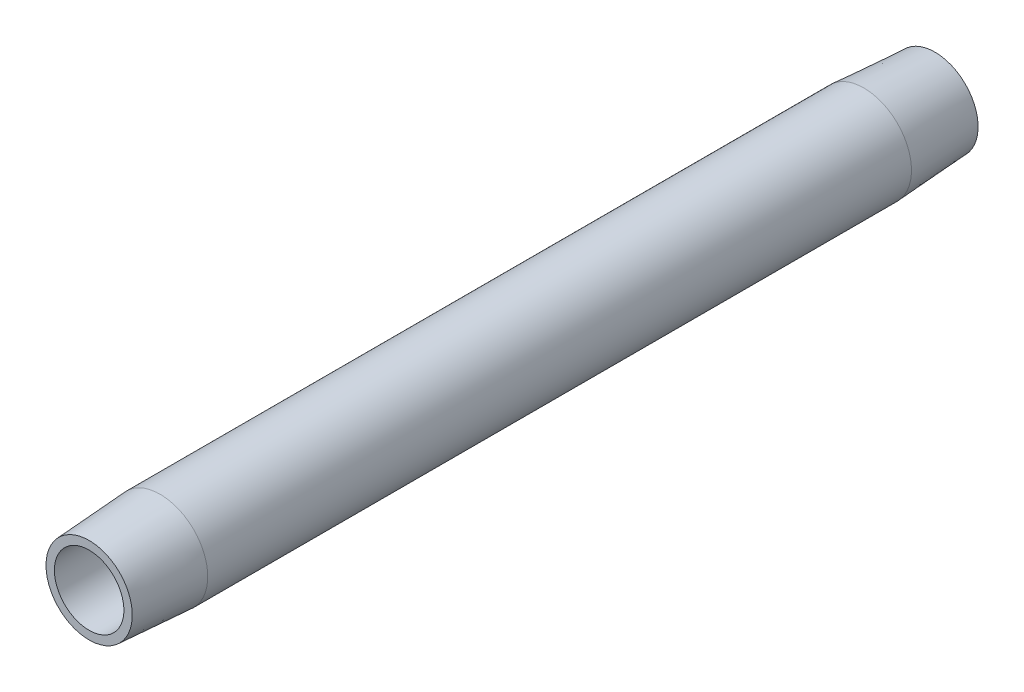
ISO-10303-21;
HEADER;
FILE_DESCRIPTION(('STEP AP214'),'2;1');
FILE_NAME('part.step','',(''),(''),'','','');
FILE_SCHEMA(('AUTOMOTIVE_DESIGN { 1 0 10303 214 1 1 1 1 }'));
ENDSEC;
DATA;
#1=APPLICATION_CONTEXT('core data for automotive mechanical design processes');
#2=APPLICATION_PROTOCOL_DEFINITION('international standard','automotive_design',2000,#1);
#3=PRODUCT_CONTEXT('',#1,'mechanical');
#4=PRODUCT('Part','Part','',(#3));
#5=PRODUCT_RELATED_PRODUCT_CATEGORY('part','',(#4));
#6=PRODUCT_DEFINITION_FORMATION('','',#4);
#7=PRODUCT_DEFINITION_CONTEXT('part definition',#1,'design');
#8=PRODUCT_DEFINITION('design','',#6,#7);
#9=PRODUCT_DEFINITION_SHAPE('','',#8);
#10=(LENGTH_UNIT() NAMED_UNIT(*) SI_UNIT(.MILLI.,.METRE.));
#11=(NAMED_UNIT(*) PLANE_ANGLE_UNIT() SI_UNIT($,.RADIAN.));
#12=(NAMED_UNIT(*) SI_UNIT($,.STERADIAN.) SOLID_ANGLE_UNIT());
#13=UNCERTAINTY_MEASURE_WITH_UNIT(LENGTH_MEASURE(1.E-05),#10,'distance_accuracy_value','');
#14=(GEOMETRIC_REPRESENTATION_CONTEXT(3) GLOBAL_UNCERTAINTY_ASSIGNED_CONTEXT((#13)) GLOBAL_UNIT_ASSIGNED_CONTEXT((#10,
#11,#12)) REPRESENTATION_CONTEXT('',''));
#15=CARTESIAN_POINT('',(0.,0.,0.));
#16=DIRECTION('',(0.,0.,1.));
#17=DIRECTION('',(1.,0.,0.));
#18=AXIS2_PLACEMENT_3D('',#15,#16,#17);
#19=CARTESIAN_POINT('',(0.,0.,-152.4));
#20=DIRECTION('',(0.,0.,1.));
#21=DIRECTION('',(1.,0.,0.));
#22=AXIS2_PLACEMENT_3D('',#19,#20,#21);
#23=CONICAL_SURFACE('',#22,7.77252700045649,0.0624188099249585);
#24=CARTESIAN_POINT('',(0.,0.,-139.60043200001));
#25=DIRECTION('',(0.,0.,-1.));
#26=DIRECTION('',(-1.,0.,0.));
#27=AXIS2_PLACEMENT_3D('',#24,#25,#26);
#28=CIRCLE('',#27,8.57249999954359);
#29=CARTESIAN_POINT('',(-8.57249999954359,0.,-139.60043200001));
#30=VERTEX_POINT('',#29);
#31=EDGE_CURVE('E10',#30,#30,#28,.T.);
#32=ORIENTED_EDGE('',*,*,#31,.T.);
#33=EDGE_LOOP('',(#32));
#34=FACE_BOUND('',#33,.T.);
#35=CARTESIAN_POINT('',(0.,0.,-152.4));
#36=DIRECTION('',(0.,0.,-1.));
#37=DIRECTION('',(-1.,0.,0.));
#38=AXIS2_PLACEMENT_3D('',#35,#36,#37);
#39=CIRCLE('',#38,7.77252700045649);
#40=CARTESIAN_POINT('',(-7.77252700045649,0.,-152.4));
#41=VERTEX_POINT('',#40);
#42=EDGE_CURVE('E52',#41,#41,#39,.T.);
#43=ORIENTED_EDGE('',*,*,#42,.F.);
#44=EDGE_LOOP('',(#43));
#45=FACE_BOUND('',#44,.T.);
#46=ADVANCED_FACE('F30',(#34,#45),#23,.T.);
#47=CARTESIAN_POINT('',(0.,0.,0.));
#48=DIRECTION('',(0.,0.,-1.));
#49=DIRECTION('',(-1.,0.,0.));
#50=AXIS2_PLACEMENT_3D('',#47,#48,#49);
#51=CYLINDRICAL_SURFACE('',#50,8.57249999954359);
#52=CARTESIAN_POINT('',(0.,0.,-12.7995679999904));
#53=DIRECTION('',(0.,0.,-1.));
#54=DIRECTION('',(-1.,0.,0.));
#55=AXIS2_PLACEMENT_3D('',#52,#53,#54);
#56=CIRCLE('',#55,8.57249999954358);
#57=CARTESIAN_POINT('',(-8.57249999954358,0.,-12.7995679999904));
#58=VERTEX_POINT('',#57);
#59=EDGE_CURVE('E36',#58,#58,#56,.T.);
#60=ORIENTED_EDGE('',*,*,#59,.T.);
#61=EDGE_LOOP('',(#60));
#62=FACE_BOUND('',#61,.T.);
#63=ORIENTED_EDGE('',*,*,#31,.F.);
#64=EDGE_LOOP('',(#63));
#65=FACE_BOUND('',#64,.T.);
#66=ADVANCED_FACE('F60',(#62,#65),#51,.T.);
#67=CARTESIAN_POINT('',(0.,0.,-12.7995679999904));
#68=DIRECTION('',(0.,0.,-1.));
#69=DIRECTION('',(-1.,0.,0.));
#70=AXIS2_PLACEMENT_3D('',#67,#68,#69);
#71=CONICAL_SURFACE('',#70,8.57249999954358,0.0624188099249577);
#72=CARTESIAN_POINT('',(0.,0.,0.));
#73=DIRECTION('',(0.,0.,-1.));
#74=DIRECTION('',(-1.,0.,0.));
#75=AXIS2_PLACEMENT_3D('',#72,#73,#74);
#76=CIRCLE('',#75,7.77252700045649);
#77=CARTESIAN_POINT('',(-7.77252700045649,0.,0.));
#78=VERTEX_POINT('',#77);
#79=EDGE_CURVE('E40',#78,#78,#76,.T.);
#80=ORIENTED_EDGE('',*,*,#79,.T.);
#81=EDGE_LOOP('',(#80));
#82=FACE_BOUND('',#81,.T.);
#83=ORIENTED_EDGE('',*,*,#59,.F.);
#84=EDGE_LOOP('',(#83));
#85=FACE_BOUND('',#84,.T.);
#86=ADVANCED_FACE('F64',(#82,#85),#71,.T.);
#87=CARTESIAN_POINT('',(7.77252700045649,0.,0.));
#88=DIRECTION('',(0.,0.,1.));
#89=DIRECTION('',(1.,0.,0.));
#90=AXIS2_PLACEMENT_3D('',#87,#88,#89);
#91=PLANE('',#90);
#92=CARTESIAN_POINT('',(0.,0.,0.));
#93=DIRECTION('',(0.,0.,-1.));
#94=DIRECTION('',(-1.,0.,0.));
#95=AXIS2_PLACEMENT_3D('',#92,#93,#94);
#96=CIRCLE('',#95,6.26109999999999);
#97=CARTESIAN_POINT('',(-6.26109999999999,0.,0.));
#98=VERTEX_POINT('',#97);
#99=EDGE_CURVE('E44',#98,#98,#96,.T.);
#100=ORIENTED_EDGE('',*,*,#99,.T.);
#101=EDGE_LOOP('',(#100));
#102=FACE_BOUND('',#101,.T.);
#103=ORIENTED_EDGE('',*,*,#79,.F.);
#104=EDGE_LOOP('',(#103));
#105=FACE_BOUND('',#104,.T.);
#106=ADVANCED_FACE('F68',(#102,#105),#91,.T.);
#107=CARTESIAN_POINT('',(0.,0.,0.));
#108=DIRECTION('',(0.,0.,-1.));
#109=DIRECTION('',(-1.,0.,0.));
#110=AXIS2_PLACEMENT_3D('',#107,#108,#109);
#111=CYLINDRICAL_SURFACE('',#110,6.2611);
#112=CARTESIAN_POINT('',(0.,0.,-152.4));
#113=DIRECTION('',(0.,0.,-1.));
#114=DIRECTION('',(-1.,0.,0.));
#115=AXIS2_PLACEMENT_3D('',#112,#113,#114);
#116=CIRCLE('',#115,6.26110000000001);
#117=CARTESIAN_POINT('',(-6.26110000000001,0.,-152.4));
#118=VERTEX_POINT('',#117);
#119=EDGE_CURVE('E49',#118,#118,#116,.T.);
#120=ORIENTED_EDGE('',*,*,#119,.T.);
#121=EDGE_LOOP('',(#120));
#122=FACE_BOUND('',#121,.T.);
#123=ORIENTED_EDGE('',*,*,#99,.F.);
#124=EDGE_LOOP('',(#123));
#125=FACE_BOUND('',#124,.T.);
#126=ADVANCED_FACE('F75',(#122,#125),#111,.F.);
#127=CARTESIAN_POINT('',(6.26110000000001,0.,-152.4));
#128=DIRECTION('',(0.,0.,-1.));
#129=DIRECTION('',(-1.,0.,0.));
#130=AXIS2_PLACEMENT_3D('',#127,#128,#129);
#131=PLANE('',#130);
#132=ORIENTED_EDGE('',*,*,#42,.T.);
#133=EDGE_LOOP('',(#132));
#134=FACE_BOUND('',#133,.T.);
#135=ORIENTED_EDGE('',*,*,#119,.F.);
#136=EDGE_LOOP('',(#135));
#137=FACE_BOUND('',#136,.T.);
#138=ADVANCED_FACE('F56',(#134,#137),#131,.T.);
#139=CLOSED_SHELL('',(#46,#66,#86,#106,#126,#138));
#140=MANIFOLD_SOLID_BREP('B2',#139);
#141=ADVANCED_BREP_SHAPE_REPRESENTATION('',(#18,#140),#14);
#142=SHAPE_DEFINITION_REPRESENTATION(#9,#141);
ENDSEC;
END-ISO-10303-21;
